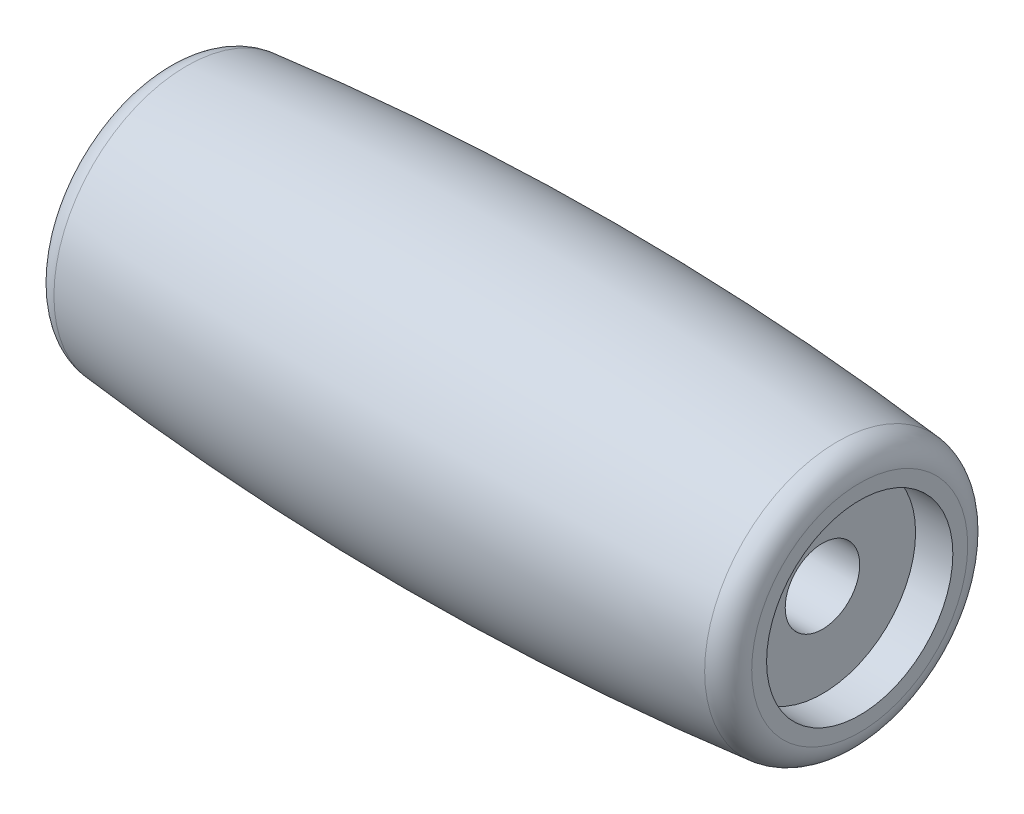
ISO-10303-21;
HEADER;
FILE_DESCRIPTION(('STEP AP214'),'2;1');
FILE_NAME('part.step','',(''),(''),'','','');
FILE_SCHEMA(('AUTOMOTIVE_DESIGN { 1 0 10303 214 1 1 1 1 }'));
ENDSEC;
DATA;
#1=APPLICATION_CONTEXT('core data for automotive mechanical design processes');
#2=APPLICATION_PROTOCOL_DEFINITION('international standard','automotive_design',2000,#1);
#3=PRODUCT_CONTEXT('',#1,'mechanical');
#4=PRODUCT('Part','Part','',(#3));
#5=PRODUCT_RELATED_PRODUCT_CATEGORY('part','',(#4));
#6=PRODUCT_DEFINITION_FORMATION('','',#4);
#7=PRODUCT_DEFINITION_CONTEXT('part definition',#1,'design');
#8=PRODUCT_DEFINITION('design','',#6,#7);
#9=PRODUCT_DEFINITION_SHAPE('','',#8);
#10=(LENGTH_UNIT() NAMED_UNIT(*) SI_UNIT(.MILLI.,.METRE.));
#11=(NAMED_UNIT(*) PLANE_ANGLE_UNIT() SI_UNIT($,.RADIAN.));
#12=(NAMED_UNIT(*) SI_UNIT($,.STERADIAN.) SOLID_ANGLE_UNIT());
#13=UNCERTAINTY_MEASURE_WITH_UNIT(LENGTH_MEASURE(1.E-05),#10,'distance_accuracy_value','');
#14=(GEOMETRIC_REPRESENTATION_CONTEXT(3) GLOBAL_UNCERTAINTY_ASSIGNED_CONTEXT((#13)) GLOBAL_UNIT_ASSIGNED_CONTEXT((#10,
#11,#12)) REPRESENTATION_CONTEXT('',''));
#15=CARTESIAN_POINT('',(0.,0.,0.));
#16=DIRECTION('',(0.,0.,1.));
#17=DIRECTION('',(1.,0.,0.));
#18=AXIS2_PLACEMENT_3D('',#15,#16,#17);
#19=CARTESIAN_POINT('',(0.,0.,0.));
#20=DIRECTION('',(-1.,0.,0.));
#21=DIRECTION('',(0.,0.,1.));
#22=AXIS2_PLACEMENT_3D('',#19,#20,#21);
#23=CYLINDRICAL_SURFACE('',#22,3.75);
#24=CARTESIAN_POINT('',(-12.5,0.,0.));
#25=DIRECTION('',(-1.,0.,0.));
#26=DIRECTION('',(0.,0.,1.));
#27=AXIS2_PLACEMENT_3D('',#24,#25,#26);
#28=CIRCLE('',#27,3.75);
#29=CARTESIAN_POINT('',(-12.5,0.,3.75));
#30=VERTEX_POINT('',#29);
#31=EDGE_CURVE('E80',#30,#30,#28,.T.);
#32=ORIENTED_EDGE('',*,*,#31,.F.);
#33=EDGE_LOOP('',(#32));
#34=FACE_BOUND('',#33,.T.);
#35=CARTESIAN_POINT('',(-14.,0.,0.));
#36=DIRECTION('',(-1.,0.,0.));
#37=DIRECTION('',(0.,0.,1.));
#38=AXIS2_PLACEMENT_3D('',#35,#36,#37);
#39=CIRCLE('',#38,3.75);
#40=CARTESIAN_POINT('',(-14.,0.,3.75));
#41=VERTEX_POINT('',#40);
#42=EDGE_CURVE('E10',#41,#41,#39,.T.);
#43=ORIENTED_EDGE('',*,*,#42,.T.);
#44=EDGE_LOOP('',(#43));
#45=FACE_BOUND('',#44,.T.);
#46=ADVANCED_FACE('F37',(#34,#45),#23,.F.);
#47=CARTESIAN_POINT('',(-14.,3.75,0.));
#48=DIRECTION('',(1.,0.,0.));
#49=DIRECTION('',(0.,0.,-1.));
#50=AXIS2_PLACEMENT_3D('',#47,#48,#49);
#51=PLANE('',#50);
#52=ORIENTED_EDGE('',*,*,#42,.F.);
#53=EDGE_LOOP('',(#52));
#54=FACE_BOUND('',#53,.T.);
#55=CARTESIAN_POINT('',(-14.,0.,0.));
#56=DIRECTION('',(-1.,0.,0.));
#57=DIRECTION('',(0.,0.,1.));
#58=AXIS2_PLACEMENT_3D('',#55,#56,#57);
#59=CIRCLE('',#58,4.34857666506388);
#60=CARTESIAN_POINT('',(-14.,0.,4.34857666506388));
#61=VERTEX_POINT('',#60);
#62=EDGE_CURVE('E44',#61,#61,#59,.T.);
#63=ORIENTED_EDGE('',*,*,#62,.T.);
#64=EDGE_LOOP('',(#63));
#65=FACE_BOUND('',#64,.T.);
#66=ADVANCED_FACE('F88',(#54,#65),#51,.F.);
#67=CARTESIAN_POINT('',(-13.,0.,0.));
#68=DIRECTION('',(-1.,0.,0.));
#69=DIRECTION('',(0.,0.,1.));
#70=AXIS2_PLACEMENT_3D('',#67,#68,#69);
#71=TOROIDAL_SURFACE('',#70,4.34857666506388,1.00000000000001);
#72=ORIENTED_EDGE('',*,*,#62,.F.);
#73=EDGE_LOOP('',(#72));
#74=FACE_BOUND('',#73,.T.);
#75=CARTESIAN_POINT('',(-13.0999679589875,0.,0.));
#76=DIRECTION('',(-1.,0.,0.));
#77=DIRECTION('',(0.,0.,1.));
#78=AXIS2_PLACEMENT_3D('',#75,#76,#77);
#79=CIRCLE('',#78,5.34356732189233);
#80=CARTESIAN_POINT('',(-13.0999679589875,0.,5.34356732189233));
#81=VERTEX_POINT('',#80);
#82=EDGE_CURVE('E49',#81,#81,#79,.T.);
#83=ORIENTED_EDGE('',*,*,#82,.T.);
#84=EDGE_LOOP('',(#83));
#85=FACE_BOUND('',#84,.T.);
#86=ADVANCED_FACE('F92',(#74,#85),#71,.T.);
#87=CARTESIAN_POINT('',(0.,0.,0.));
#88=DIRECTION('',(-1.,0.,0.));
#89=DIRECTION('',(0.,0.,1.));
#90=AXIS2_PLACEMENT_3D('',#87,#88,#89);
#91=DEGENERATE_TOROIDAL_SURFACE('',#90,125.041666666666,131.041666666666,.F.);
#92=ORIENTED_EDGE('',*,*,#82,.F.);
#93=EDGE_LOOP('',(#92));
#94=FACE_BOUND('',#93,.T.);
#95=CARTESIAN_POINT('',(13.0999679589875,0.,0.));
#96=DIRECTION('',(-1.,0.,0.));
#97=DIRECTION('',(0.,0.,1.));
#98=AXIS2_PLACEMENT_3D('',#95,#96,#97);
#99=CIRCLE('',#98,5.34356732189234);
#100=CARTESIAN_POINT('',(13.0999679589875,0.,5.34356732189234));
#101=VERTEX_POINT('',#100);
#102=EDGE_CURVE('E54',#101,#101,#99,.T.);
#103=ORIENTED_EDGE('',*,*,#102,.T.);
#104=EDGE_LOOP('',(#103));
#105=FACE_BOUND('',#104,.T.);
#106=ADVANCED_FACE('F97',(#94,#105),#91,.F.);
#107=CARTESIAN_POINT('',(13.,0.,0.));
#108=DIRECTION('',(-1.,0.,0.));
#109=DIRECTION('',(0.,0.,1.));
#110=AXIS2_PLACEMENT_3D('',#107,#108,#109);
#111=TOROIDAL_SURFACE('',#110,4.34857666506388,1.00000000000001);
#112=ORIENTED_EDGE('',*,*,#102,.F.);
#113=EDGE_LOOP('',(#112));
#114=FACE_BOUND('',#113,.T.);
#115=CARTESIAN_POINT('',(14.,0.,0.));
#116=DIRECTION('',(-1.,0.,0.));
#117=DIRECTION('',(0.,0.,1.));
#118=AXIS2_PLACEMENT_3D('',#115,#116,#117);
#119=CIRCLE('',#118,4.34857666506388);
#120=CARTESIAN_POINT('',(14.,0.,4.34857666506388));
#121=VERTEX_POINT('',#120);
#122=EDGE_CURVE('E60',#121,#121,#119,.T.);
#123=ORIENTED_EDGE('',*,*,#122,.T.);
#124=EDGE_LOOP('',(#123));
#125=FACE_BOUND('',#124,.T.);
#126=ADVANCED_FACE('F103',(#114,#125),#111,.T.);
#127=CARTESIAN_POINT('',(14.,3.75,0.));
#128=DIRECTION('',(-1.,0.,0.));
#129=DIRECTION('',(0.,0.,1.));
#130=AXIS2_PLACEMENT_3D('',#127,#128,#129);
#131=PLANE('',#130);
#132=ORIENTED_EDGE('',*,*,#122,.F.);
#133=EDGE_LOOP('',(#132));
#134=FACE_BOUND('',#133,.T.);
#135=CARTESIAN_POINT('',(14.,0.,0.));
#136=DIRECTION('',(-1.,0.,0.));
#137=DIRECTION('',(0.,0.,1.));
#138=AXIS2_PLACEMENT_3D('',#135,#136,#137);
#139=CIRCLE('',#138,3.75);
#140=CARTESIAN_POINT('',(14.,0.,3.75));
#141=VERTEX_POINT('',#140);
#142=EDGE_CURVE('E64',#141,#141,#139,.T.);
#143=ORIENTED_EDGE('',*,*,#142,.T.);
#144=EDGE_LOOP('',(#143));
#145=FACE_BOUND('',#144,.T.);
#146=ADVANCED_FACE('F107',(#134,#145),#131,.F.);
#147=CARTESIAN_POINT('',(0.,0.,0.));
#148=DIRECTION('',(-1.,0.,0.));
#149=DIRECTION('',(0.,0.,1.));
#150=AXIS2_PLACEMENT_3D('',#147,#148,#149);
#151=CYLINDRICAL_SURFACE('',#150,3.75);
#152=ORIENTED_EDGE('',*,*,#142,.F.);
#153=EDGE_LOOP('',(#152));
#154=FACE_BOUND('',#153,.T.);
#155=CARTESIAN_POINT('',(12.5,0.,0.));
#156=DIRECTION('',(-1.,0.,0.));
#157=DIRECTION('',(0.,0.,1.));
#158=AXIS2_PLACEMENT_3D('',#155,#156,#157);
#159=CIRCLE('',#158,3.75);
#160=CARTESIAN_POINT('',(12.5,0.,3.75));
#161=VERTEX_POINT('',#160);
#162=EDGE_CURVE('E68',#161,#161,#159,.T.);
#163=ORIENTED_EDGE('',*,*,#162,.T.);
#164=EDGE_LOOP('',(#163));
#165=FACE_BOUND('',#164,.T.);
#166=ADVANCED_FACE('F111',(#154,#165),#151,.F.);
#167=CARTESIAN_POINT('',(12.5,1.5,0.));
#168=DIRECTION('',(-1.,0.,0.));
#169=DIRECTION('',(0.,0.,1.));
#170=AXIS2_PLACEMENT_3D('',#167,#168,#169);
#171=PLANE('',#170);
#172=ORIENTED_EDGE('',*,*,#162,.F.);
#173=EDGE_LOOP('',(#172));
#174=FACE_BOUND('',#173,.T.);
#175=CARTESIAN_POINT('',(12.5,0.,0.));
#176=DIRECTION('',(-1.,0.,0.));
#177=DIRECTION('',(0.,0.,1.));
#178=AXIS2_PLACEMENT_3D('',#175,#176,#177);
#179=CIRCLE('',#178,1.5);
#180=CARTESIAN_POINT('',(12.5,0.,1.5));
#181=VERTEX_POINT('',#180);
#182=EDGE_CURVE('E72',#181,#181,#179,.T.);
#183=ORIENTED_EDGE('',*,*,#182,.T.);
#184=EDGE_LOOP('',(#183));
#185=FACE_BOUND('',#184,.T.);
#186=ADVANCED_FACE('F115',(#174,#185),#171,.F.);
#187=CARTESIAN_POINT('',(0.,0.,0.));
#188=DIRECTION('',(-1.,0.,0.));
#189=DIRECTION('',(0.,0.,1.));
#190=AXIS2_PLACEMENT_3D('',#187,#188,#189);
#191=CYLINDRICAL_SURFACE('',#190,1.5);
#192=ORIENTED_EDGE('',*,*,#182,.F.);
#193=EDGE_LOOP('',(#192));
#194=FACE_BOUND('',#193,.T.);
#195=CARTESIAN_POINT('',(-12.5,0.,0.));
#196=DIRECTION('',(-1.,0.,0.));
#197=DIRECTION('',(0.,0.,1.));
#198=AXIS2_PLACEMENT_3D('',#195,#196,#197);
#199=CIRCLE('',#198,1.5);
#200=CARTESIAN_POINT('',(-12.5,0.,1.5));
#201=VERTEX_POINT('',#200);
#202=EDGE_CURVE('E76',#201,#201,#199,.T.);
#203=ORIENTED_EDGE('',*,*,#202,.T.);
#204=EDGE_LOOP('',(#203));
#205=FACE_BOUND('',#204,.T.);
#206=ADVANCED_FACE('F119',(#194,#205),#191,.F.);
#207=CARTESIAN_POINT('',(-12.5,1.5,0.));
#208=DIRECTION('',(1.,0.,0.));
#209=DIRECTION('',(0.,0.,-1.));
#210=AXIS2_PLACEMENT_3D('',#207,#208,#209);
#211=PLANE('',#210);
#212=ORIENTED_EDGE('',*,*,#202,.F.);
#213=EDGE_LOOP('',(#212));
#214=FACE_BOUND('',#213,.T.);
#215=ORIENTED_EDGE('',*,*,#31,.T.);
#216=EDGE_LOOP('',(#215));
#217=FACE_BOUND('',#216,.T.);
#218=ADVANCED_FACE('F85',(#214,#217),#211,.F.);
#219=CLOSED_SHELL('',(#46,#66,#86,#106,#126,#146,#166,#186,#206,#218));
#220=MANIFOLD_SOLID_BREP('B2',#219);
#221=ADVANCED_BREP_SHAPE_REPRESENTATION('',(#18,#220),#14);
#222=SHAPE_DEFINITION_REPRESENTATION(#9,#221);
ENDSEC;
END-ISO-10303-21;
